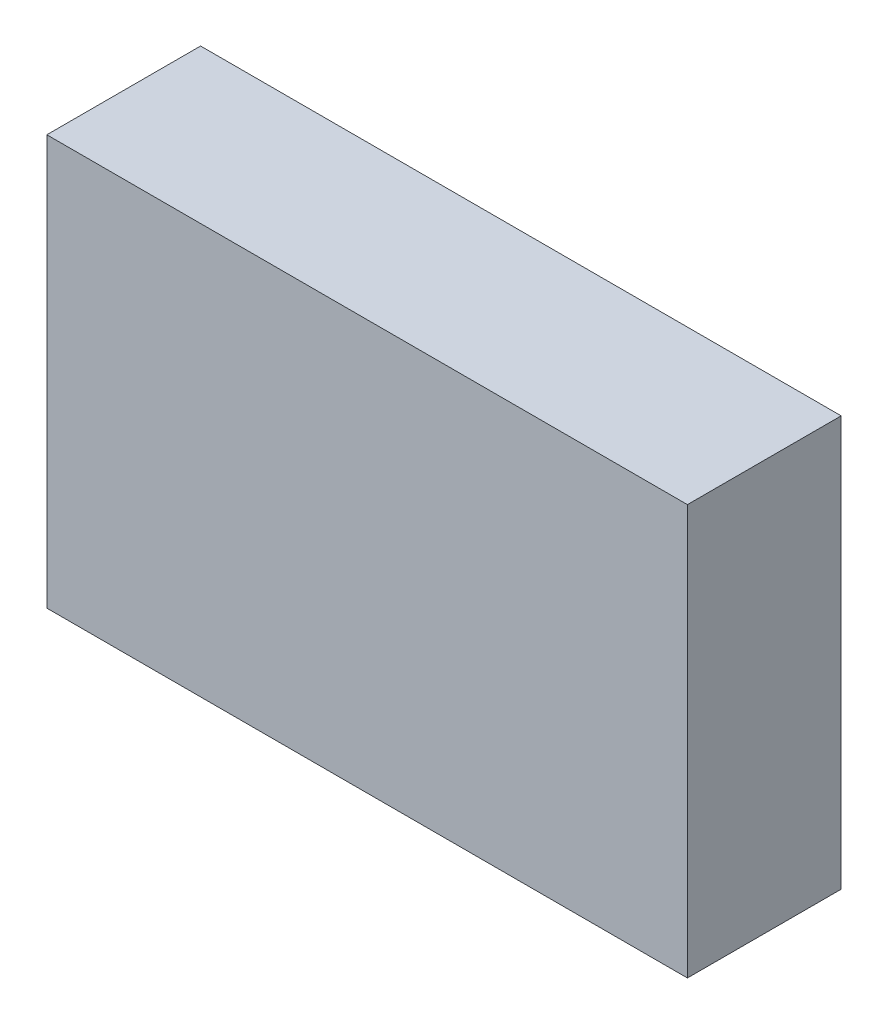
ISO-10303-21;
HEADER;
FILE_DESCRIPTION(('STEP AP214'),'2;1');
FILE_NAME('part.step','',(''),(''),'','','');
FILE_SCHEMA(('AUTOMOTIVE_DESIGN { 1 0 10303 214 1 1 1 1 }'));
ENDSEC;
DATA;
#1=APPLICATION_CONTEXT('core data for automotive mechanical design processes');
#2=APPLICATION_PROTOCOL_DEFINITION('international standard','automotive_design',2000,#1);
#3=PRODUCT_CONTEXT('',#1,'mechanical');
#4=PRODUCT('Part','Part','',(#3));
#5=PRODUCT_RELATED_PRODUCT_CATEGORY('part','',(#4));
#6=PRODUCT_DEFINITION_FORMATION('','',#4);
#7=PRODUCT_DEFINITION_CONTEXT('part definition',#1,'design');
#8=PRODUCT_DEFINITION('design','',#6,#7);
#9=PRODUCT_DEFINITION_SHAPE('','',#8);
#10=(LENGTH_UNIT() NAMED_UNIT(*) SI_UNIT(.MILLI.,.METRE.));
#11=(NAMED_UNIT(*) PLANE_ANGLE_UNIT() SI_UNIT($,.RADIAN.));
#12=(NAMED_UNIT(*) SI_UNIT($,.STERADIAN.) SOLID_ANGLE_UNIT());
#13=UNCERTAINTY_MEASURE_WITH_UNIT(LENGTH_MEASURE(1.E-05),#10,'distance_accuracy_value','');
#14=(GEOMETRIC_REPRESENTATION_CONTEXT(3) GLOBAL_UNCERTAINTY_ASSIGNED_CONTEXT((#13)) GLOBAL_UNIT_ASSIGNED_CONTEXT((#10,
#11,#12)) REPRESENTATION_CONTEXT('',''));
#15=CARTESIAN_POINT('',(0.,0.,0.));
#16=DIRECTION('',(0.,0.,1.));
#17=DIRECTION('',(1.,0.,0.));
#18=AXIS2_PLACEMENT_3D('',#15,#16,#17);
#19=CARTESIAN_POINT('',(-2.50000008,-1.59999934,1.20000014));
#20=DIRECTION('',(0.,0.,-1.));
#21=DIRECTION('',(-1.,0.,0.));
#22=AXIS2_PLACEMENT_3D('',#19,#20,#21);
#23=PLANE('',#22);
#24=DIRECTION('',(0.,1.,0.));
#25=VECTOR('',#24,1.);
#26=CARTESIAN_POINT('',(2.50000008,-1.59999934,1.20000014));
#27=LINE('',#26,#25);
#28=CARTESIAN_POINT('',(2.50000008,-1.59999934,1.20000014));
#29=VERTEX_POINT('',#28);
#30=CARTESIAN_POINT('',(2.50000008,1.59999934,1.20000014));
#31=VERTEX_POINT('',#30);
#32=EDGE_CURVE('E55',#29,#31,#27,.T.);
#33=ORIENTED_EDGE('',*,*,#32,.T.);
#34=DIRECTION('',(1.,0.,0.));
#35=VECTOR('',#34,1.);
#36=CARTESIAN_POINT('',(2.50000008,1.59999934,1.20000014));
#37=LINE('',#36,#35);
#38=CARTESIAN_POINT('',(-2.50000008,1.59999934,1.20000014));
#39=VERTEX_POINT('',#38);
#40=EDGE_CURVE('E57',#31,#39,#37,.F.);
#41=ORIENTED_EDGE('',*,*,#40,.T.);
#42=DIRECTION('',(0.,1.,0.));
#43=VECTOR('',#42,1.);
#44=CARTESIAN_POINT('',(-2.50000008,1.59999934,1.20000014));
#45=LINE('',#44,#43);
#46=CARTESIAN_POINT('',(-2.50000008,-1.59999934,1.20000014));
#47=VERTEX_POINT('',#46);
#48=EDGE_CURVE('E20',#39,#47,#45,.F.);
#49=ORIENTED_EDGE('',*,*,#48,.T.);
#50=DIRECTION('',(1.,0.,0.));
#51=VECTOR('',#50,1.);
#52=CARTESIAN_POINT('',(-2.50000008,-1.59999934,1.20000014));
#53=LINE('',#52,#51);
#54=EDGE_CURVE('E80',#47,#29,#53,.T.);
#55=ORIENTED_EDGE('',*,*,#54,.T.);
#56=EDGE_LOOP('',(#33,#41,#49,#55));
#57=FACE_BOUND('',#56,.T.);
#58=ADVANCED_FACE('F17',(#57),#23,.F.);
#59=CARTESIAN_POINT('',(-2.50000008,1.59999934,0.));
#60=DIRECTION('',(1.,0.,0.));
#61=DIRECTION('',(0.,0.,-1.));
#62=AXIS2_PLACEMENT_3D('',#59,#60,#61);
#63=PLANE('',#62);
#64=DIRECTION('',(0.,0.,1.));
#65=VECTOR('',#64,1.);
#66=CARTESIAN_POINT('',(-2.50000008,-1.59999934,0.));
#67=LINE('',#66,#65);
#68=CARTESIAN_POINT('',(-2.50000008,-1.59999934,0.));
#69=VERTEX_POINT('',#68);
#70=EDGE_CURVE('E68',#69,#47,#67,.T.);
#71=ORIENTED_EDGE('',*,*,#70,.T.);
#72=ORIENTED_EDGE('',*,*,#48,.F.);
#73=DIRECTION('',(0.,0.,-1.));
#74=VECTOR('',#73,1.);
#75=CARTESIAN_POINT('',(-2.50000008,1.59999934,0.));
#76=LINE('',#75,#74);
#77=CARTESIAN_POINT('',(-2.50000008,1.59999934,0.));
#78=VERTEX_POINT('',#77);
#79=EDGE_CURVE('E63',#39,#78,#76,.T.);
#80=ORIENTED_EDGE('',*,*,#79,.T.);
#81=DIRECTION('',(0.,1.,0.));
#82=VECTOR('',#81,1.);
#83=CARTESIAN_POINT('',(-2.50000008,-1.59999934,0.));
#84=LINE('',#83,#82);
#85=EDGE_CURVE('E83',#69,#78,#84,.T.);
#86=ORIENTED_EDGE('',*,*,#85,.F.);
#87=EDGE_LOOP('',(#71,#72,#80,#86));
#88=FACE_BOUND('',#87,.T.);
#89=ADVANCED_FACE('F65',(#88),#63,.F.);
#90=CARTESIAN_POINT('',(2.50000008,1.59999934,0.));
#91=DIRECTION('',(0.,-1.,0.));
#92=DIRECTION('',(0.,0.,-1.));
#93=AXIS2_PLACEMENT_3D('',#90,#91,#92);
#94=PLANE('',#93);
#95=ORIENTED_EDGE('',*,*,#79,.F.);
#96=ORIENTED_EDGE('',*,*,#40,.F.);
#97=DIRECTION('',(0.,0.,1.));
#98=VECTOR('',#97,1.);
#99=CARTESIAN_POINT('',(2.50000008,1.59999934,0.));
#100=LINE('',#99,#98);
#101=CARTESIAN_POINT('',(2.50000008,1.59999934,0.));
#102=VERTEX_POINT('',#101);
#103=EDGE_CURVE('E75',#31,#102,#100,.F.);
#104=ORIENTED_EDGE('',*,*,#103,.T.);
#105=DIRECTION('',(-1.,0.,0.));
#106=VECTOR('',#105,1.);
#107=CARTESIAN_POINT('',(-2.50000008,1.59999934,0.));
#108=LINE('',#107,#106);
#109=EDGE_CURVE('E72',#78,#102,#108,.F.);
#110=ORIENTED_EDGE('',*,*,#109,.F.);
#111=EDGE_LOOP('',(#95,#96,#104,#110));
#112=FACE_BOUND('',#111,.T.);
#113=ADVANCED_FACE('F70',(#112),#94,.F.);
#114=CARTESIAN_POINT('',(2.50000008,-1.59999934,0.));
#115=DIRECTION('',(-1.,0.,0.));
#116=DIRECTION('',(0.,0.,1.));
#117=AXIS2_PLACEMENT_3D('',#114,#115,#116);
#118=PLANE('',#117);
#119=ORIENTED_EDGE('',*,*,#103,.F.);
#120=ORIENTED_EDGE('',*,*,#32,.F.);
#121=DIRECTION('',(0.,0.,1.));
#122=VECTOR('',#121,1.);
#123=CARTESIAN_POINT('',(2.50000008,-1.59999934,0.));
#124=LINE('',#123,#122);
#125=CARTESIAN_POINT('',(2.50000008,-1.59999934,0.));
#126=VERTEX_POINT('',#125);
#127=EDGE_CURVE('E35',#29,#126,#124,.F.);
#128=ORIENTED_EDGE('',*,*,#127,.T.);
#129=DIRECTION('',(0.,1.,0.));
#130=VECTOR('',#129,1.);
#131=CARTESIAN_POINT('',(2.50000008,-1.59999934,0.));
#132=LINE('',#131,#130);
#133=EDGE_CURVE('E26',#102,#126,#132,.F.);
#134=ORIENTED_EDGE('',*,*,#133,.F.);
#135=EDGE_LOOP('',(#119,#120,#128,#134));
#136=FACE_BOUND('',#135,.T.);
#137=ADVANCED_FACE('F89',(#136),#118,.F.);
#138=CARTESIAN_POINT('',(-2.50000008,-1.59999934,0.));
#139=DIRECTION('',(0.,1.,0.));
#140=DIRECTION('',(0.,0.,1.));
#141=AXIS2_PLACEMENT_3D('',#138,#139,#140);
#142=PLANE('',#141);
#143=ORIENTED_EDGE('',*,*,#127,.F.);
#144=ORIENTED_EDGE('',*,*,#54,.F.);
#145=ORIENTED_EDGE('',*,*,#70,.F.);
#146=DIRECTION('',(-1.,0.,0.));
#147=VECTOR('',#146,1.);
#148=CARTESIAN_POINT('',(-2.50000008,-1.59999934,0.));
#149=LINE('',#148,#147);
#150=EDGE_CURVE('E11',#126,#69,#149,.T.);
#151=ORIENTED_EDGE('',*,*,#150,.F.);
#152=EDGE_LOOP('',(#143,#144,#145,#151));
#153=FACE_BOUND('',#152,.T.);
#154=ADVANCED_FACE('F91',(#153),#142,.F.);
#155=CARTESIAN_POINT('',(-2.50000008,-1.59999934,0.));
#156=DIRECTION('',(0.,0.,-1.));
#157=DIRECTION('',(-1.,0.,0.));
#158=AXIS2_PLACEMENT_3D('',#155,#156,#157);
#159=PLANE('',#158);
#160=ORIENTED_EDGE('',*,*,#133,.T.);
#161=ORIENTED_EDGE('',*,*,#150,.T.);
#162=ORIENTED_EDGE('',*,*,#85,.T.);
#163=ORIENTED_EDGE('',*,*,#109,.T.);
#164=EDGE_LOOP('',(#160,#161,#162,#163));
#165=FACE_BOUND('',#164,.T.);
#166=ADVANCED_FACE('F88',(#165),#159,.T.);
#167=CLOSED_SHELL('',(#58,#89,#113,#137,#154,#166));
#168=MANIFOLD_SOLID_BREP('B1',#167);
#169=ADVANCED_BREP_SHAPE_REPRESENTATION('',(#18,#168),#14);
#170=SHAPE_DEFINITION_REPRESENTATION(#9,#169);
ENDSEC;
END-ISO-10303-21;
